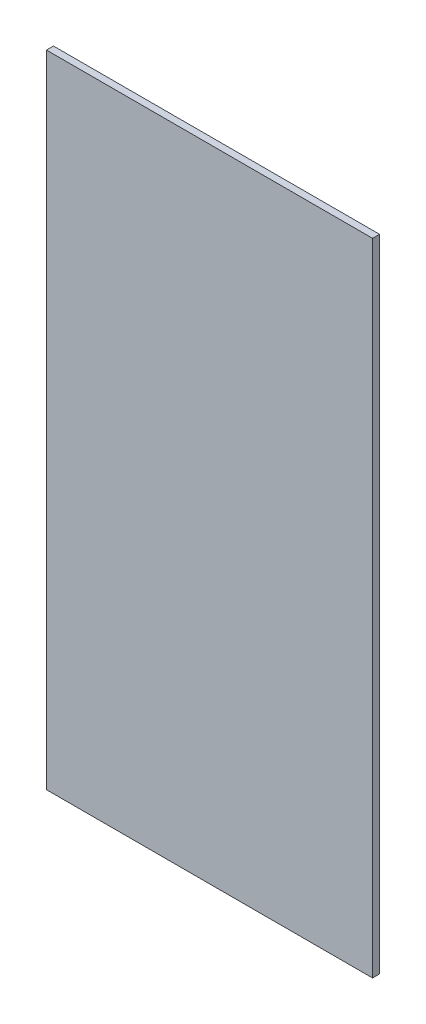
ISO-10303-21;
HEADER;
FILE_DESCRIPTION(('STEP AP214'),'2;1');
FILE_NAME('part.step','',(''),(''),'','','');
FILE_SCHEMA(('AUTOMOTIVE_DESIGN { 1 0 10303 214 1 1 1 1 }'));
ENDSEC;
DATA;
#1=APPLICATION_CONTEXT('core data for automotive mechanical design processes');
#2=APPLICATION_PROTOCOL_DEFINITION('international standard','automotive_design',2000,#1);
#3=PRODUCT_CONTEXT('',#1,'mechanical');
#4=PRODUCT('Part','Part','',(#3));
#5=PRODUCT_RELATED_PRODUCT_CATEGORY('part','',(#4));
#6=PRODUCT_DEFINITION_FORMATION('','',#4);
#7=PRODUCT_DEFINITION_CONTEXT('part definition',#1,'design');
#8=PRODUCT_DEFINITION('design','',#6,#7);
#9=PRODUCT_DEFINITION_SHAPE('','',#8);
#10=(LENGTH_UNIT() NAMED_UNIT(*) SI_UNIT(.MILLI.,.METRE.));
#11=(NAMED_UNIT(*) PLANE_ANGLE_UNIT() SI_UNIT($,.RADIAN.));
#12=(NAMED_UNIT(*) SI_UNIT($,.STERADIAN.) SOLID_ANGLE_UNIT());
#13=UNCERTAINTY_MEASURE_WITH_UNIT(LENGTH_MEASURE(1.E-05),#10,'distance_accuracy_value','');
#14=(GEOMETRIC_REPRESENTATION_CONTEXT(3) GLOBAL_UNCERTAINTY_ASSIGNED_CONTEXT((#13)) GLOBAL_UNIT_ASSIGNED_CONTEXT((#10,
#11,#12)) REPRESENTATION_CONTEXT('',''));
#15=CARTESIAN_POINT('',(0.,0.,0.));
#16=DIRECTION('',(0.,0.,1.));
#17=DIRECTION('',(1.,0.,0.));
#18=AXIS2_PLACEMENT_3D('',#15,#16,#17);
#19=CARTESIAN_POINT('',(69.9999999999998,-137.5,2.99999999999992));
#20=DIRECTION('',(-1.,0.,0.));
#21=DIRECTION('',(0.,0.,1.));
#22=AXIS2_PLACEMENT_3D('',#19,#20,#21);
#23=PLANE('',#22);
#24=DIRECTION('',(0.,1.,0.));
#25=VECTOR('',#24,1.);
#26=CARTESIAN_POINT('',(70.0000000000001,-137.5,0.));
#27=LINE('',#26,#25);
#28=CARTESIAN_POINT('',(70.0000000000001,-137.5,0.));
#29=VERTEX_POINT('',#28);
#30=CARTESIAN_POINT('',(70.0000000000001,137.5,1.11022302462516E-13));
#31=VERTEX_POINT('',#30);
#32=EDGE_CURVE('E107',#29,#31,#27,.T.);
#33=ORIENTED_EDGE('',*,*,#32,.T.);
#34=DIRECTION('',(0.,0.,-1.));
#35=VECTOR('',#34,1.);
#36=CARTESIAN_POINT('',(69.9999999999998,137.5,2.99999999999995));
#37=LINE('',#36,#35);
#38=CARTESIAN_POINT('',(69.9999999999998,137.5,2.99999999999995));
#39=VERTEX_POINT('',#38);
#40=EDGE_CURVE('E11',#39,#31,#37,.T.);
#41=ORIENTED_EDGE('',*,*,#40,.F.);
#42=DIRECTION('',(0.,1.,0.));
#43=VECTOR('',#42,1.);
#44=CARTESIAN_POINT('',(69.9999999999998,-137.5,2.99999999999992));
#45=LINE('',#44,#43);
#46=CARTESIAN_POINT('',(69.9999999999998,-137.5,2.99999999999992));
#47=VERTEX_POINT('',#46);
#48=EDGE_CURVE('E90',#47,#39,#45,.T.);
#49=ORIENTED_EDGE('',*,*,#48,.F.);
#50=DIRECTION('',(0.,0.,-1.));
#51=VECTOR('',#50,1.);
#52=CARTESIAN_POINT('',(69.9999999999998,-137.5,2.99999999999992));
#53=LINE('',#52,#51);
#54=EDGE_CURVE('E103',#47,#29,#53,.T.);
#55=ORIENTED_EDGE('',*,*,#54,.T.);
#56=EDGE_LOOP('',(#33,#41,#49,#55));
#57=FACE_BOUND('',#56,.T.);
#58=ADVANCED_FACE('F38',(#57),#23,.F.);
#59=CARTESIAN_POINT('',(-69.9999999999998,137.5,2.99999999999975));
#60=DIRECTION('',(0.,-1.,0.));
#61=DIRECTION('',(0.,0.,-1.));
#62=AXIS2_PLACEMENT_3D('',#59,#60,#61);
#63=PLANE('',#62);
#64=DIRECTION('',(-1.,0.,0.));
#65=VECTOR('',#64,1.);
#66=CARTESIAN_POINT('',(-69.9999999999992,137.5,0.));
#67=LINE('',#66,#65);
#68=CARTESIAN_POINT('',(-69.9999999999992,137.5,0.));
#69=VERTEX_POINT('',#68);
#70=EDGE_CURVE('E95',#31,#69,#67,.T.);
#71=ORIENTED_EDGE('',*,*,#70,.T.);
#72=DIRECTION('',(0.,0.,-1.));
#73=VECTOR('',#72,1.);
#74=CARTESIAN_POINT('',(-69.9999999999998,137.5,2.99999999999975));
#75=LINE('',#74,#73);
#76=CARTESIAN_POINT('',(-69.9999999999998,137.5,2.99999999999975));
#77=VERTEX_POINT('',#76);
#78=EDGE_CURVE('E47',#77,#69,#75,.T.);
#79=ORIENTED_EDGE('',*,*,#78,.F.);
#80=DIRECTION('',(-1.,0.,0.));
#81=VECTOR('',#80,1.);
#82=CARTESIAN_POINT('',(-69.9999999999998,137.5,2.99999999999975));
#83=LINE('',#82,#81);
#84=EDGE_CURVE('E85',#39,#77,#83,.T.);
#85=ORIENTED_EDGE('',*,*,#84,.F.);
#86=ORIENTED_EDGE('',*,*,#40,.T.);
#87=EDGE_LOOP('',(#71,#79,#85,#86));
#88=FACE_BOUND('',#87,.T.);
#89=ADVANCED_FACE('F94',(#88),#63,.F.);
#90=CARTESIAN_POINT('',(-69.9999999999992,-137.5,2.99999999999992));
#91=DIRECTION('',(1.,0.,0.));
#92=DIRECTION('',(0.,0.,-1.));
#93=AXIS2_PLACEMENT_3D('',#90,#91,#92);
#94=PLANE('',#93);
#95=DIRECTION('',(0.,-1.,0.));
#96=VECTOR('',#95,1.);
#97=CARTESIAN_POINT('',(-69.9999999999998,-137.5,-1.38777878078145E-13));
#98=LINE('',#97,#96);
#99=CARTESIAN_POINT('',(-69.9999999999998,-137.5,-1.38777878078145E-13));
#100=VERTEX_POINT('',#99);
#101=EDGE_CURVE('E72',#69,#100,#98,.T.);
#102=ORIENTED_EDGE('',*,*,#101,.T.);
#103=DIRECTION('',(0.,0.,-1.));
#104=VECTOR('',#103,1.);
#105=CARTESIAN_POINT('',(-69.9999999999992,-137.5,2.99999999999992));
#106=LINE('',#105,#104);
#107=CARTESIAN_POINT('',(-69.9999999999992,-137.5,2.99999999999992));
#108=VERTEX_POINT('',#107);
#109=EDGE_CURVE('E97',#108,#100,#106,.T.);
#110=ORIENTED_EDGE('',*,*,#109,.F.);
#111=DIRECTION('',(0.,-1.,0.));
#112=VECTOR('',#111,1.);
#113=CARTESIAN_POINT('',(-69.9999999999992,-137.5,2.99999999999992));
#114=LINE('',#113,#112);
#115=EDGE_CURVE('E88',#77,#108,#114,.T.);
#116=ORIENTED_EDGE('',*,*,#115,.F.);
#117=ORIENTED_EDGE('',*,*,#78,.T.);
#118=EDGE_LOOP('',(#102,#110,#116,#117));
#119=FACE_BOUND('',#118,.T.);
#120=ADVANCED_FACE('F98',(#119),#94,.F.);
#121=CARTESIAN_POINT('',(-69.9999999999992,-137.5,2.99999999999992));
#122=DIRECTION('',(0.,1.,0.));
#123=DIRECTION('',(0.,0.,1.));
#124=AXIS2_PLACEMENT_3D('',#121,#122,#123);
#125=PLANE('',#124);
#126=DIRECTION('',(1.,0.,0.));
#127=VECTOR('',#126,1.);
#128=CARTESIAN_POINT('',(-69.9999999999998,-137.5,-1.38777878078145E-13));
#129=LINE('',#128,#127);
#130=EDGE_CURVE('E78',#100,#29,#129,.T.);
#131=ORIENTED_EDGE('',*,*,#130,.T.);
#132=ORIENTED_EDGE('',*,*,#54,.F.);
#133=DIRECTION('',(1.,0.,0.));
#134=VECTOR('',#133,1.);
#135=CARTESIAN_POINT('',(-69.9999999999992,-137.5,2.99999999999992));
#136=LINE('',#135,#134);
#137=EDGE_CURVE('E55',#108,#47,#136,.T.);
#138=ORIENTED_EDGE('',*,*,#137,.F.);
#139=ORIENTED_EDGE('',*,*,#109,.T.);
#140=EDGE_LOOP('',(#131,#132,#138,#139));
#141=FACE_BOUND('',#140,.T.);
#142=ADVANCED_FACE('F121',(#141),#125,.F.);
#143=CARTESIAN_POINT('',(1.11022302462516E-12,0.,3.00000000000011));
#144=DIRECTION('',(0.,0.,-1.));
#145=DIRECTION('',(-1.,0.,0.));
#146=AXIS2_PLACEMENT_3D('',#143,#144,#145);
#147=PLANE('',#146);
#148=ORIENTED_EDGE('',*,*,#48,.T.);
#149=ORIENTED_EDGE('',*,*,#84,.T.);
#150=ORIENTED_EDGE('',*,*,#115,.T.);
#151=ORIENTED_EDGE('',*,*,#137,.T.);
#152=EDGE_LOOP('',(#148,#149,#150,#151));
#153=FACE_BOUND('',#152,.T.);
#154=ADVANCED_FACE('F86',(#153),#147,.F.);
#155=CARTESIAN_POINT('',(0.,0.,0.));
#156=DIRECTION('',(0.,0.,-1.));
#157=DIRECTION('',(-1.,0.,0.));
#158=AXIS2_PLACEMENT_3D('',#155,#156,#157);
#159=PLANE('',#158);
#160=ORIENTED_EDGE('',*,*,#32,.F.);
#161=ORIENTED_EDGE('',*,*,#130,.F.);
#162=ORIENTED_EDGE('',*,*,#101,.F.);
#163=ORIENTED_EDGE('',*,*,#70,.F.);
#164=EDGE_LOOP('',(#160,#161,#162,#163));
#165=FACE_BOUND('',#164,.T.);
#166=ADVANCED_FACE('F124',(#165),#159,.T.);
#167=CLOSED_SHELL('',(#58,#89,#120,#142,#154,#166));
#168=MANIFOLD_SOLID_BREP('B2',#167);
#169=ADVANCED_BREP_SHAPE_REPRESENTATION('',(#18,#168),#14);
#170=SHAPE_DEFINITION_REPRESENTATION(#9,#169);
ENDSEC;
END-ISO-10303-21;
